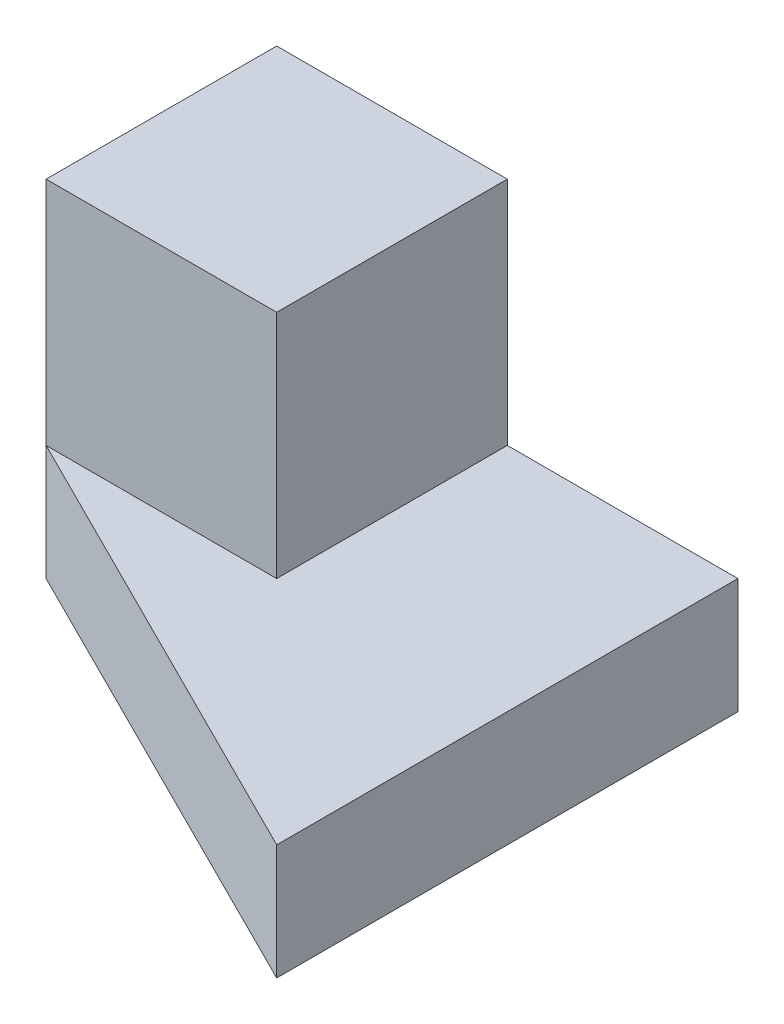
ISO-10303-21;
HEADER;
FILE_DESCRIPTION(('STEP AP214'),'2;1');
FILE_NAME('part.step','',(''),(''),'','','');
FILE_SCHEMA(('AUTOMOTIVE_DESIGN { 1 0 10303 214 1 1 1 1 }'));
ENDSEC;
DATA;
#1=APPLICATION_CONTEXT('core data for automotive mechanical design processes');
#2=APPLICATION_PROTOCOL_DEFINITION('international standard','automotive_design',2000,#1);
#3=PRODUCT_CONTEXT('',#1,'mechanical');
#4=PRODUCT('Part','Part','',(#3));
#5=PRODUCT_RELATED_PRODUCT_CATEGORY('part','',(#4));
#6=PRODUCT_DEFINITION_FORMATION('','',#4);
#7=PRODUCT_DEFINITION_CONTEXT('part definition',#1,'design');
#8=PRODUCT_DEFINITION('design','',#6,#7);
#9=PRODUCT_DEFINITION_SHAPE('','',#8);
#10=(LENGTH_UNIT() NAMED_UNIT(*) SI_UNIT(.MILLI.,.METRE.));
#11=(NAMED_UNIT(*) PLANE_ANGLE_UNIT() SI_UNIT($,.RADIAN.));
#12=(NAMED_UNIT(*) SI_UNIT($,.STERADIAN.) SOLID_ANGLE_UNIT());
#13=UNCERTAINTY_MEASURE_WITH_UNIT(LENGTH_MEASURE(1.E-05),#10,'distance_accuracy_value','');
#14=(GEOMETRIC_REPRESENTATION_CONTEXT(3) GLOBAL_UNCERTAINTY_ASSIGNED_CONTEXT((#13)) GLOBAL_UNIT_ASSIGNED_CONTEXT((#10,
#11,#12)) REPRESENTATION_CONTEXT('',''));
#15=CARTESIAN_POINT('',(0.,0.,0.));
#16=DIRECTION('',(0.,0.,1.));
#17=DIRECTION('',(1.,0.,0.));
#18=AXIS2_PLACEMENT_3D('',#15,#16,#17);
#19=CARTESIAN_POINT('',(0.,10.,0.));
#20=DIRECTION('',(0.,1.,0.));
#21=DIRECTION('',(0.,0.,1.));
#22=AXIS2_PLACEMENT_3D('',#19,#20,#21);
#23=PLANE('',#22);
#24=DIRECTION('',(-1.,0.,0.));
#25=VECTOR('',#24,1.);
#26=CARTESIAN_POINT('',(0.,10.,-20.));
#27=LINE('',#26,#25);
#28=CARTESIAN_POINT('',(0.,10.,-20.));
#29=VERTEX_POINT('',#28);
#30=CARTESIAN_POINT('',(-20.,10.,-20.));
#31=VERTEX_POINT('',#30);
#32=EDGE_CURVE('E143',#29,#31,#27,.T.);
#33=ORIENTED_EDGE('',*,*,#32,.T.);
#34=DIRECTION('',(0.,0.,1.));
#35=VECTOR('',#34,1.);
#36=CARTESIAN_POINT('',(-20.,10.,-20.));
#37=LINE('',#36,#35);
#38=CARTESIAN_POINT('',(-20.,10.,0.));
#39=VERTEX_POINT('',#38);
#40=EDGE_CURVE('E129',#31,#39,#37,.T.);
#41=ORIENTED_EDGE('',*,*,#40,.T.);
#42=DIRECTION('',(-1.,0.,0.));
#43=VECTOR('',#42,1.);
#44=CARTESIAN_POINT('',(-20.,10.,0.));
#45=LINE('',#44,#43);
#46=CARTESIAN_POINT('',(-40.,10.,0.));
#47=VERTEX_POINT('',#46);
#48=EDGE_CURVE('E106',#39,#47,#45,.T.);
#49=ORIENTED_EDGE('',*,*,#48,.T.);
#50=DIRECTION('',(0.894427190999916,0.,0.447213595499958));
#51=VECTOR('',#50,1.);
#52=CARTESIAN_POINT('',(-40.,10.,0.));
#53=LINE('',#52,#51);
#54=CARTESIAN_POINT('',(0.,10.,20.));
#55=VERTEX_POINT('',#54);
#56=EDGE_CURVE('E147',#47,#55,#53,.T.);
#57=ORIENTED_EDGE('',*,*,#56,.T.);
#58=DIRECTION('',(0.,0.,1.));
#59=VECTOR('',#58,1.);
#60=CARTESIAN_POINT('',(0.,10.,-20.));
#61=LINE('',#60,#59);
#62=EDGE_CURVE('E151',#29,#55,#61,.T.);
#63=ORIENTED_EDGE('',*,*,#62,.F.);
#64=EDGE_LOOP('',(#33,#41,#49,#57,#63));
#65=FACE_BOUND('',#64,.T.);
#66=ADVANCED_FACE('F39',(#65),#23,.T.);
#67=CARTESIAN_POINT('',(0.,10.,-20.));
#68=DIRECTION('',(0.,0.,1.));
#69=DIRECTION('',(1.,0.,0.));
#70=AXIS2_PLACEMENT_3D('',#67,#68,#69);
#71=PLANE('',#70);
#72=DIRECTION('',(-1.,0.,0.));
#73=VECTOR('',#72,1.);
#74=CARTESIAN_POINT('',(0.,0.,-20.));
#75=LINE('',#74,#73);
#76=CARTESIAN_POINT('',(0.,0.,-20.));
#77=VERTEX_POINT('',#76);
#78=CARTESIAN_POINT('',(-40.,0.,-20.));
#79=VERTEX_POINT('',#78);
#80=EDGE_CURVE('E140',#77,#79,#75,.T.);
#81=ORIENTED_EDGE('',*,*,#80,.T.);
#82=DIRECTION('',(0.,-1.,0.));
#83=VECTOR('',#82,1.);
#84=CARTESIAN_POINT('',(-40.,10.,-20.));
#85=LINE('',#84,#83);
#86=CARTESIAN_POINT('',(-40.,30.,-20.));
#87=VERTEX_POINT('',#86);
#88=EDGE_CURVE('E11',#87,#79,#85,.T.);
#89=ORIENTED_EDGE('',*,*,#88,.F.);
#90=DIRECTION('',(1.,0.,0.));
#91=VECTOR('',#90,1.);
#92=CARTESIAN_POINT('',(-40.,30.,-20.));
#93=LINE('',#92,#91);
#94=CARTESIAN_POINT('',(-20.,30.,-20.));
#95=VERTEX_POINT('',#94);
#96=EDGE_CURVE('E112',#87,#95,#93,.T.);
#97=ORIENTED_EDGE('',*,*,#96,.T.);
#98=DIRECTION('',(0.,-1.,0.));
#99=VECTOR('',#98,1.);
#100=CARTESIAN_POINT('',(-20.,30.,-20.));
#101=LINE('',#100,#99);
#102=EDGE_CURVE('E125',#95,#31,#101,.T.);
#103=ORIENTED_EDGE('',*,*,#102,.T.);
#104=ORIENTED_EDGE('',*,*,#32,.F.);
#105=DIRECTION('',(0.,-1.,0.));
#106=VECTOR('',#105,1.);
#107=CARTESIAN_POINT('',(0.,10.,-20.));
#108=LINE('',#107,#106);
#109=EDGE_CURVE('E57',#29,#77,#108,.T.);
#110=ORIENTED_EDGE('',*,*,#109,.T.);
#111=EDGE_LOOP('',(#81,#89,#97,#103,#104,#110));
#112=FACE_BOUND('',#111,.T.);
#113=ADVANCED_FACE('F41',(#112),#71,.F.);
#114=CARTESIAN_POINT('',(-40.,10.,-20.));
#115=DIRECTION('',(1.,0.,0.));
#116=DIRECTION('',(0.,0.,-1.));
#117=AXIS2_PLACEMENT_3D('',#114,#115,#116);
#118=PLANE('',#117);
#119=DIRECTION('',(0.,0.,1.));
#120=VECTOR('',#119,1.);
#121=CARTESIAN_POINT('',(-40.,0.,-20.));
#122=LINE('',#121,#120);
#123=CARTESIAN_POINT('',(-40.,0.,0.));
#124=VERTEX_POINT('',#123);
#125=EDGE_CURVE('E156',#79,#124,#122,.T.);
#126=ORIENTED_EDGE('',*,*,#125,.T.);
#127=DIRECTION('',(0.,-1.,0.));
#128=VECTOR('',#127,1.);
#129=CARTESIAN_POINT('',(-40.,10.,0.));
#130=LINE('',#129,#128);
#131=EDGE_CURVE('E49',#47,#124,#130,.T.);
#132=ORIENTED_EDGE('',*,*,#131,.F.);
#133=DIRECTION('',(0.,-1.,0.));
#134=VECTOR('',#133,1.);
#135=CARTESIAN_POINT('',(-40.,30.,0.));
#136=LINE('',#135,#134);
#137=CARTESIAN_POINT('',(-40.,30.,0.));
#138=VERTEX_POINT('',#137);
#139=EDGE_CURVE('E83',#138,#47,#136,.T.);
#140=ORIENTED_EDGE('',*,*,#139,.F.);
#141=DIRECTION('',(0.,0.,1.));
#142=VECTOR('',#141,1.);
#143=CARTESIAN_POINT('',(-40.,30.,-20.));
#144=LINE('',#143,#142);
#145=EDGE_CURVE('E121',#87,#138,#144,.T.);
#146=ORIENTED_EDGE('',*,*,#145,.F.);
#147=ORIENTED_EDGE('',*,*,#88,.T.);
#148=EDGE_LOOP('',(#126,#132,#140,#146,#147));
#149=FACE_BOUND('',#148,.T.);
#150=ADVANCED_FACE('F186',(#149),#118,.F.);
#151=CARTESIAN_POINT('',(-40.,10.,0.));
#152=DIRECTION('',(0.447213595499958,0.,-0.894427190999916));
#153=DIRECTION('',(-0.894427190999916,0.,-0.447213595499958));
#154=AXIS2_PLACEMENT_3D('',#151,#152,#153);
#155=PLANE('',#154);
#156=DIRECTION('',(0.894427190999916,0.,0.447213595499958));
#157=VECTOR('',#156,1.);
#158=CARTESIAN_POINT('',(-40.,0.,0.));
#159=LINE('',#158,#157);
#160=CARTESIAN_POINT('',(0.,0.,20.));
#161=VERTEX_POINT('',#160);
#162=EDGE_CURVE('E159',#124,#161,#159,.T.);
#163=ORIENTED_EDGE('',*,*,#162,.T.);
#164=DIRECTION('',(0.,-1.,0.));
#165=VECTOR('',#164,1.);
#166=CARTESIAN_POINT('',(0.,10.,20.));
#167=LINE('',#166,#165);
#168=EDGE_CURVE('E73',#55,#161,#167,.T.);
#169=ORIENTED_EDGE('',*,*,#168,.F.);
#170=ORIENTED_EDGE('',*,*,#56,.F.);
#171=ORIENTED_EDGE('',*,*,#131,.T.);
#172=EDGE_LOOP('',(#163,#169,#170,#171));
#173=FACE_BOUND('',#172,.T.);
#174=ADVANCED_FACE('F174',(#173),#155,.F.);
#175=CARTESIAN_POINT('',(0.,10.,-20.));
#176=DIRECTION('',(1.,0.,0.));
#177=DIRECTION('',(0.,0.,-1.));
#178=AXIS2_PLACEMENT_3D('',#175,#176,#177);
#179=PLANE('',#178);
#180=DIRECTION('',(0.,0.,1.));
#181=VECTOR('',#180,1.);
#182=CARTESIAN_POINT('',(0.,0.,-20.));
#183=LINE('',#182,#181);
#184=EDGE_CURVE('E148',#77,#161,#183,.T.);
#185=ORIENTED_EDGE('',*,*,#184,.F.);
#186=ORIENTED_EDGE('',*,*,#109,.F.);
#187=ORIENTED_EDGE('',*,*,#62,.T.);
#188=ORIENTED_EDGE('',*,*,#168,.T.);
#189=EDGE_LOOP('',(#185,#186,#187,#188));
#190=FACE_BOUND('',#189,.T.);
#191=ADVANCED_FACE('F178',(#190),#179,.T.);
#192=CARTESIAN_POINT('',(0.,0.,0.));
#193=DIRECTION('',(0.,1.,0.));
#194=DIRECTION('',(0.,0.,1.));
#195=AXIS2_PLACEMENT_3D('',#192,#193,#194);
#196=PLANE('',#195);
#197=ORIENTED_EDGE('',*,*,#80,.F.);
#198=ORIENTED_EDGE('',*,*,#184,.T.);
#199=ORIENTED_EDGE('',*,*,#162,.F.);
#200=ORIENTED_EDGE('',*,*,#125,.F.);
#201=EDGE_LOOP('',(#197,#198,#199,#200));
#202=FACE_BOUND('',#201,.T.);
#203=ADVANCED_FACE('F177',(#202),#196,.F.);
#204=CARTESIAN_POINT('',(-20.,30.,-20.));
#205=DIRECTION('',(1.,0.,0.));
#206=DIRECTION('',(0.,0.,-1.));
#207=AXIS2_PLACEMENT_3D('',#204,#205,#206);
#208=PLANE('',#207);
#209=ORIENTED_EDGE('',*,*,#40,.F.);
#210=ORIENTED_EDGE('',*,*,#102,.F.);
#211=DIRECTION('',(0.,0.,1.));
#212=VECTOR('',#211,1.);
#213=CARTESIAN_POINT('',(-20.,30.,-20.));
#214=LINE('',#213,#212);
#215=CARTESIAN_POINT('',(-20.,30.,0.));
#216=VERTEX_POINT('',#215);
#217=EDGE_CURVE('E118',#95,#216,#214,.T.);
#218=ORIENTED_EDGE('',*,*,#217,.T.);
#219=DIRECTION('',(0.,-1.,0.));
#220=VECTOR('',#219,1.);
#221=CARTESIAN_POINT('',(-20.,30.,0.));
#222=LINE('',#221,#220);
#223=EDGE_CURVE('E102',#216,#39,#222,.T.);
#224=ORIENTED_EDGE('',*,*,#223,.T.);
#225=EDGE_LOOP('',(#209,#210,#218,#224));
#226=FACE_BOUND('',#225,.T.);
#227=ADVANCED_FACE('F124',(#226),#208,.T.);
#228=CARTESIAN_POINT('',(-20.,30.,0.));
#229=DIRECTION('',(0.,0.,1.));
#230=DIRECTION('',(1.,0.,0.));
#231=AXIS2_PLACEMENT_3D('',#228,#229,#230);
#232=PLANE('',#231);
#233=ORIENTED_EDGE('',*,*,#48,.F.);
#234=ORIENTED_EDGE('',*,*,#223,.F.);
#235=DIRECTION('',(-1.,0.,0.));
#236=VECTOR('',#235,1.);
#237=CARTESIAN_POINT('',(-20.,30.,0.));
#238=LINE('',#237,#236);
#239=EDGE_CURVE('E105',#216,#138,#238,.T.);
#240=ORIENTED_EDGE('',*,*,#239,.T.);
#241=ORIENTED_EDGE('',*,*,#139,.T.);
#242=EDGE_LOOP('',(#233,#234,#240,#241));
#243=FACE_BOUND('',#242,.T.);
#244=ADVANCED_FACE('F104',(#243),#232,.T.);
#245=CARTESIAN_POINT('',(0.,30.,0.));
#246=DIRECTION('',(0.,-1.,0.));
#247=DIRECTION('',(0.,0.,-1.));
#248=AXIS2_PLACEMENT_3D('',#245,#246,#247);
#249=PLANE('',#248);
#250=ORIENTED_EDGE('',*,*,#217,.F.);
#251=ORIENTED_EDGE('',*,*,#96,.F.);
#252=ORIENTED_EDGE('',*,*,#145,.T.);
#253=ORIENTED_EDGE('',*,*,#239,.F.);
#254=EDGE_LOOP('',(#250,#251,#252,#253));
#255=FACE_BOUND('',#254,.T.);
#256=ADVANCED_FACE('F116',(#255),#249,.F.);
#257=CLOSED_SHELL('',(#66,#113,#150,#174,#191,#203,#227,#244,#256));
#258=MANIFOLD_SOLID_BREP('B2',#257);
#259=ADVANCED_BREP_SHAPE_REPRESENTATION('',(#18,#258),#14);
#260=SHAPE_DEFINITION_REPRESENTATION(#9,#259);
ENDSEC;
END-ISO-10303-21;
